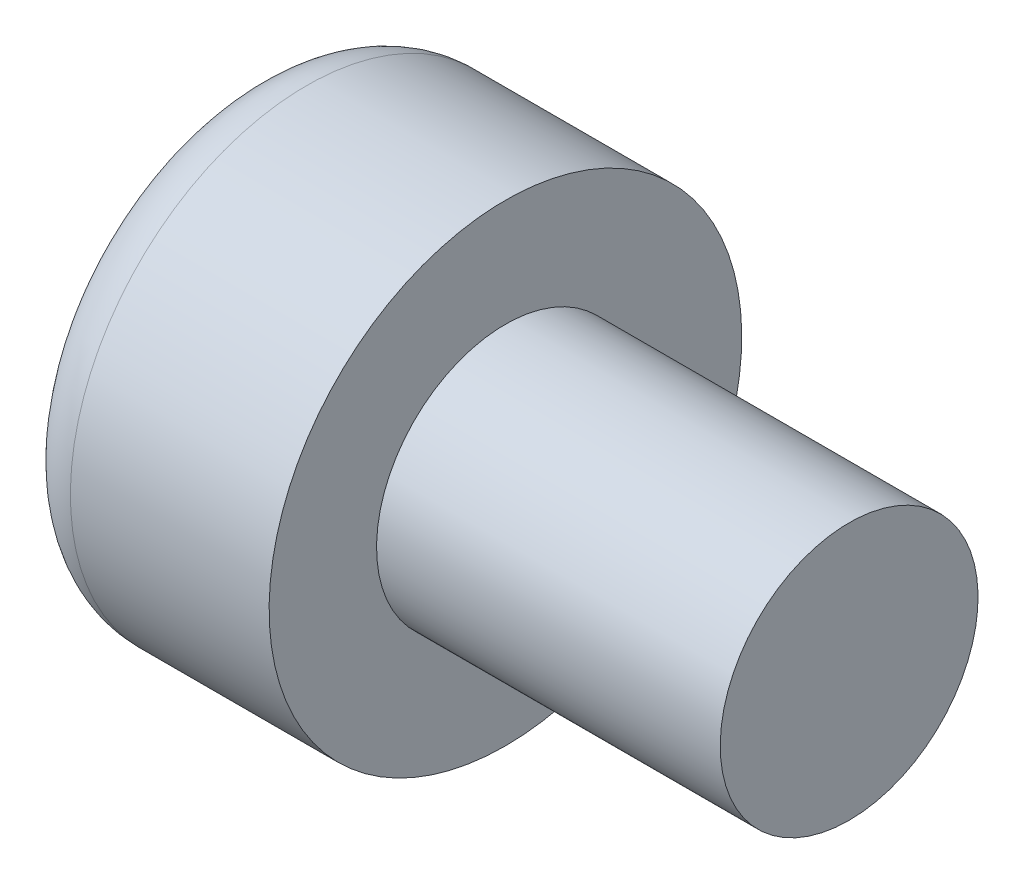
ISO-10303-21;
HEADER;
FILE_DESCRIPTION(('STEP AP214'),'2;1');
FILE_NAME('part.step','',(''),(''),'','','');
FILE_SCHEMA(('AUTOMOTIVE_DESIGN { 1 0 10303 214 1 1 1 1 }'));
ENDSEC;
DATA;
#1=APPLICATION_CONTEXT('core data for automotive mechanical design processes');
#2=APPLICATION_PROTOCOL_DEFINITION('international standard','automotive_design',2000,#1);
#3=PRODUCT_CONTEXT('',#1,'mechanical');
#4=PRODUCT('Part','Part','',(#3));
#5=PRODUCT_RELATED_PRODUCT_CATEGORY('part','',(#4));
#6=PRODUCT_DEFINITION_FORMATION('','',#4);
#7=PRODUCT_DEFINITION_CONTEXT('part definition',#1,'design');
#8=PRODUCT_DEFINITION('design','',#6,#7);
#9=PRODUCT_DEFINITION_SHAPE('','',#8);
#10=(LENGTH_UNIT() NAMED_UNIT(*) SI_UNIT(.MILLI.,.METRE.));
#11=(NAMED_UNIT(*) PLANE_ANGLE_UNIT() SI_UNIT($,.RADIAN.));
#12=(NAMED_UNIT(*) SI_UNIT($,.STERADIAN.) SOLID_ANGLE_UNIT());
#13=UNCERTAINTY_MEASURE_WITH_UNIT(LENGTH_MEASURE(1.E-05),#10,'distance_accuracy_value','');
#14=(GEOMETRIC_REPRESENTATION_CONTEXT(3) GLOBAL_UNCERTAINTY_ASSIGNED_CONTEXT((#13)) GLOBAL_UNIT_ASSIGNED_CONTEXT((#10,
#11,#12)) REPRESENTATION_CONTEXT('',''));
#15=CARTESIAN_POINT('',(0.,0.,0.));
#16=DIRECTION('',(0.,0.,1.));
#17=DIRECTION('',(1.,0.,0.));
#18=AXIS2_PLACEMENT_3D('',#15,#16,#17);
#19=CARTESIAN_POINT('',(0.,0.,0.));
#20=DIRECTION('',(1.,0.,0.));
#21=DIRECTION('',(0.,1.,0.));
#22=AXIS2_PLACEMENT_3D('',#19,#20,#21);
#23=PLANE('',#22);
#24=DIRECTION('',(0.,-0.5,-0.866025403784438));
#25=VECTOR('',#24,1.);
#26=CARTESIAN_POINT('',(0.,1.44337567297406,0.));
#27=LINE('',#26,#25);
#28=CARTESIAN_POINT('',(0.,1.44337567297406,0.));
#29=VERTEX_POINT('',#28);
#30=CARTESIAN_POINT('',(0.,0.721687836487031,-1.25));
#31=VERTEX_POINT('',#30);
#32=EDGE_CURVE('E121',#29,#31,#27,.T.);
#33=ORIENTED_EDGE('',*,*,#32,.F.);
#34=DIRECTION('',(0.,0.5,-0.866025403784439));
#35=VECTOR('',#34,1.);
#36=CARTESIAN_POINT('',(0.,0.721687836487032,1.25));
#37=LINE('',#36,#35);
#38=CARTESIAN_POINT('',(0.,0.721687836487032,1.25));
#39=VERTEX_POINT('',#38);
#40=EDGE_CURVE('E47',#39,#29,#37,.T.);
#41=ORIENTED_EDGE('',*,*,#40,.F.);
#42=DIRECTION('',(0.,1.,0.));
#43=VECTOR('',#42,1.);
#44=CARTESIAN_POINT('',(0.,-0.721687836487031,1.25));
#45=LINE('',#44,#43);
#46=CARTESIAN_POINT('',(0.,-0.721687836487031,1.25));
#47=VERTEX_POINT('',#46);
#48=EDGE_CURVE('E130',#47,#39,#45,.T.);
#49=ORIENTED_EDGE('',*,*,#48,.F.);
#50=DIRECTION('',(0.,0.5,0.866025403784439));
#51=VECTOR('',#50,1.);
#52=CARTESIAN_POINT('',(0.,-1.44337567297406,0.));
#53=LINE('',#52,#51);
#54=CARTESIAN_POINT('',(0.,-1.44337567297406,0.));
#55=VERTEX_POINT('',#54);
#56=EDGE_CURVE('E128',#55,#47,#53,.T.);
#57=ORIENTED_EDGE('',*,*,#56,.F.);
#58=DIRECTION('',(0.,-0.5,0.866025403784438));
#59=VECTOR('',#58,1.);
#60=CARTESIAN_POINT('',(0.,-0.721687836487032,-1.25));
#61=LINE('',#60,#59);
#62=CARTESIAN_POINT('',(0.,-0.721687836487032,-1.25));
#63=VERTEX_POINT('',#62);
#64=EDGE_CURVE('E95',#63,#55,#61,.T.);
#65=ORIENTED_EDGE('',*,*,#64,.F.);
#66=DIRECTION('',(0.,-1.,0.));
#67=VECTOR('',#66,1.);
#68=CARTESIAN_POINT('',(0.,0.721687836487031,-1.25));
#69=LINE('',#68,#67);
#70=EDGE_CURVE('E124',#31,#63,#69,.T.);
#71=ORIENTED_EDGE('',*,*,#70,.F.);
#72=EDGE_LOOP('',(#33,#41,#49,#57,#65,#71));
#73=FACE_BOUND('',#72,.T.);
#74=CARTESIAN_POINT('',(0.,0.,0.));
#75=DIRECTION('',(-1.,0.,0.));
#76=DIRECTION('',(0.,-1.,0.));
#77=AXIS2_PLACEMENT_3D('',#74,#75,#76);
#78=CIRCLE('',#77,2.0625);
#79=CARTESIAN_POINT('',(0.,-2.0625,0.));
#80=VERTEX_POINT('',#79);
#81=EDGE_CURVE('E11',#80,#80,#78,.T.);
#82=ORIENTED_EDGE('',*,*,#81,.T.);
#83=EDGE_LOOP('',(#82));
#84=FACE_BOUND('',#83,.T.);
#85=ADVANCED_FACE('F33',(#73,#84),#23,.F.);
#86=CARTESIAN_POINT('',(0.6875,0.,0.));
#87=DIRECTION('',(-1.,0.,0.));
#88=DIRECTION('',(0.,-1.,0.));
#89=AXIS2_PLACEMENT_3D('',#86,#87,#88);
#90=TOROIDAL_SURFACE('',#89,2.0625,0.6875);
#91=ORIENTED_EDGE('',*,*,#81,.F.);
#92=EDGE_LOOP('',(#91));
#93=FACE_BOUND('',#92,.T.);
#94=CARTESIAN_POINT('',(0.6875,0.,0.));
#95=DIRECTION('',(-1.,0.,0.));
#96=DIRECTION('',(0.,-1.,0.));
#97=AXIS2_PLACEMENT_3D('',#94,#95,#96);
#98=CIRCLE('',#97,2.75);
#99=CARTESIAN_POINT('',(0.6875,-2.75,0.));
#100=VERTEX_POINT('',#99);
#101=EDGE_CURVE('E40',#100,#100,#98,.T.);
#102=ORIENTED_EDGE('',*,*,#101,.T.);
#103=EDGE_LOOP('',(#102));
#104=FACE_BOUND('',#103,.T.);
#105=ADVANCED_FACE('F150',(#93,#104),#90,.T.);
#106=CARTESIAN_POINT('',(0.,0.,0.));
#107=DIRECTION('',(-1.,0.,0.));
#108=DIRECTION('',(0.,-1.,0.));
#109=AXIS2_PLACEMENT_3D('',#106,#107,#108);
#110=CYLINDRICAL_SURFACE('',#109,2.75);
#111=ORIENTED_EDGE('',*,*,#101,.F.);
#112=EDGE_LOOP('',(#111));
#113=FACE_BOUND('',#112,.T.);
#114=CARTESIAN_POINT('',(3.,0.,0.));
#115=DIRECTION('',(-1.,0.,0.));
#116=DIRECTION('',(0.,-1.,0.));
#117=AXIS2_PLACEMENT_3D('',#114,#115,#116);
#118=CIRCLE('',#117,2.75);
#119=CARTESIAN_POINT('',(3.,-2.75,0.));
#120=VERTEX_POINT('',#119);
#121=EDGE_CURVE('E145',#120,#120,#118,.T.);
#122=ORIENTED_EDGE('',*,*,#121,.T.);
#123=EDGE_LOOP('',(#122));
#124=FACE_BOUND('',#123,.T.);
#125=ADVANCED_FACE('F152',(#113,#124),#110,.T.);
#126=CARTESIAN_POINT('',(3.,2.75,0.));
#127=DIRECTION('',(-1.,0.,0.));
#128=DIRECTION('',(0.,-1.,0.));
#129=AXIS2_PLACEMENT_3D('',#126,#127,#128);
#130=PLANE('',#129);
#131=ORIENTED_EDGE('',*,*,#121,.F.);
#132=EDGE_LOOP('',(#131));
#133=FACE_BOUND('',#132,.T.);
#134=CARTESIAN_POINT('',(3.,0.,0.));
#135=DIRECTION('',(-1.,0.,0.));
#136=DIRECTION('',(0.,-1.,0.));
#137=AXIS2_PLACEMENT_3D('',#134,#135,#136);
#138=CIRCLE('',#137,1.5);
#139=CARTESIAN_POINT('',(3.,-1.5,0.));
#140=VERTEX_POINT('',#139);
#141=EDGE_CURVE('E142',#140,#140,#138,.T.);
#142=ORIENTED_EDGE('',*,*,#141,.T.);
#143=EDGE_LOOP('',(#142));
#144=FACE_BOUND('',#143,.T.);
#145=ADVANCED_FACE('F155',(#133,#144),#130,.F.);
#146=CARTESIAN_POINT('',(0.,0.,0.));
#147=DIRECTION('',(-1.,0.,0.));
#148=DIRECTION('',(0.,-1.,0.));
#149=AXIS2_PLACEMENT_3D('',#146,#147,#148);
#150=CYLINDRICAL_SURFACE('',#149,1.5);
#151=ORIENTED_EDGE('',*,*,#141,.F.);
#152=EDGE_LOOP('',(#151));
#153=FACE_BOUND('',#152,.T.);
#154=CARTESIAN_POINT('',(7.,0.,0.));
#155=DIRECTION('',(-1.,0.,0.));
#156=DIRECTION('',(0.,-1.,0.));
#157=AXIS2_PLACEMENT_3D('',#154,#155,#156);
#158=CIRCLE('',#157,1.5);
#159=CARTESIAN_POINT('',(7.,-1.5,0.));
#160=VERTEX_POINT('',#159);
#161=EDGE_CURVE('E134',#160,#160,#158,.T.);
#162=ORIENTED_EDGE('',*,*,#161,.T.);
#163=EDGE_LOOP('',(#162));
#164=FACE_BOUND('',#163,.T.);
#165=ADVANCED_FACE('F161',(#153,#164),#150,.T.);
#166=CARTESIAN_POINT('',(7.,1.5,0.));
#167=DIRECTION('',(-1.,0.,0.));
#168=DIRECTION('',(0.,-1.,0.));
#169=AXIS2_PLACEMENT_3D('',#166,#167,#168);
#170=PLANE('',#169);
#171=ORIENTED_EDGE('',*,*,#161,.F.);
#172=EDGE_LOOP('',(#171));
#173=FACE_BOUND('',#172,.T.);
#174=ADVANCED_FACE('F167',(#173),#170,.F.);
#175=CARTESIAN_POINT('',(1.5,0.721687836487032,1.25));
#176=DIRECTION('',(0.,0.866025403784438,0.5));
#177=DIRECTION('',(0.,-0.5,0.866025403784439));
#178=AXIS2_PLACEMENT_3D('',#175,#176,#177);
#179=PLANE('',#178);
#180=ORIENTED_EDGE('',*,*,#40,.T.);
#181=DIRECTION('',(-1.,0.,0.));
#182=VECTOR('',#181,1.);
#183=CARTESIAN_POINT('',(1.5,1.44337567297406,0.));
#184=LINE('',#183,#182);
#185=CARTESIAN_POINT('',(1.5,1.44337567297406,0.));
#186=VERTEX_POINT('',#185);
#187=EDGE_CURVE('E77',#186,#29,#184,.T.);
#188=ORIENTED_EDGE('',*,*,#187,.F.);
#189=DIRECTION('',(0.,0.5,-0.866025403784439));
#190=VECTOR('',#189,1.);
#191=CARTESIAN_POINT('',(1.5,0.721687836487032,1.25));
#192=LINE('',#191,#190);
#193=CARTESIAN_POINT('',(1.5,0.721687836487032,1.25));
#194=VERTEX_POINT('',#193);
#195=EDGE_CURVE('E132',#194,#186,#192,.T.);
#196=ORIENTED_EDGE('',*,*,#195,.F.);
#197=DIRECTION('',(-1.,0.,0.));
#198=VECTOR('',#197,1.);
#199=CARTESIAN_POINT('',(1.5,0.721687836487032,1.25));
#200=LINE('',#199,#198);
#201=EDGE_CURVE('E55',#194,#39,#200,.T.);
#202=ORIENTED_EDGE('',*,*,#201,.T.);
#203=EDGE_LOOP('',(#180,#188,#196,#202));
#204=FACE_BOUND('',#203,.T.);
#205=ADVANCED_FACE('F172',(#204),#179,.F.);
#206=CARTESIAN_POINT('',(1.5,-0.721687836487031,1.25));
#207=DIRECTION('',(0.,0.,1.));
#208=DIRECTION('',(1.,0.,0.));
#209=AXIS2_PLACEMENT_3D('',#206,#207,#208);
#210=PLANE('',#209);
#211=ORIENTED_EDGE('',*,*,#48,.T.);
#212=ORIENTED_EDGE('',*,*,#201,.F.);
#213=DIRECTION('',(0.,1.,0.));
#214=VECTOR('',#213,1.);
#215=CARTESIAN_POINT('',(1.5,-0.721687836487031,1.25));
#216=LINE('',#215,#214);
#217=CARTESIAN_POINT('',(1.5,-0.721687836487031,1.25));
#218=VERTEX_POINT('',#217);
#219=EDGE_CURVE('E107',#218,#194,#216,.T.);
#220=ORIENTED_EDGE('',*,*,#219,.F.);
#221=DIRECTION('',(-1.,0.,0.));
#222=VECTOR('',#221,1.);
#223=CARTESIAN_POINT('',(1.5,-0.721687836487031,1.25));
#224=LINE('',#223,#222);
#225=EDGE_CURVE('E99',#218,#47,#224,.T.);
#226=ORIENTED_EDGE('',*,*,#225,.T.);
#227=EDGE_LOOP('',(#211,#212,#220,#226));
#228=FACE_BOUND('',#227,.T.);
#229=ADVANCED_FACE('F177',(#228),#210,.F.);
#230=CARTESIAN_POINT('',(1.5,-1.44337567297406,0.));
#231=DIRECTION('',(0.,-0.866025403784439,0.5));
#232=DIRECTION('',(0.,-0.5,-0.866025403784439));
#233=AXIS2_PLACEMENT_3D('',#230,#231,#232);
#234=PLANE('',#233);
#235=ORIENTED_EDGE('',*,*,#56,.T.);
#236=ORIENTED_EDGE('',*,*,#225,.F.);
#237=DIRECTION('',(0.,0.5,0.866025403784439));
#238=VECTOR('',#237,1.);
#239=CARTESIAN_POINT('',(1.5,-1.44337567297406,0.));
#240=LINE('',#239,#238);
#241=CARTESIAN_POINT('',(1.5,-1.44337567297406,0.));
#242=VERTEX_POINT('',#241);
#243=EDGE_CURVE('E103',#242,#218,#240,.T.);
#244=ORIENTED_EDGE('',*,*,#243,.F.);
#245=DIRECTION('',(-1.,0.,0.));
#246=VECTOR('',#245,1.);
#247=CARTESIAN_POINT('',(1.5,-1.44337567297406,0.));
#248=LINE('',#247,#246);
#249=EDGE_CURVE('E88',#242,#55,#248,.T.);
#250=ORIENTED_EDGE('',*,*,#249,.T.);
#251=EDGE_LOOP('',(#235,#236,#244,#250));
#252=FACE_BOUND('',#251,.T.);
#253=ADVANCED_FACE('F104',(#252),#234,.F.);
#254=CARTESIAN_POINT('',(1.5,-0.721687836487032,-1.25));
#255=DIRECTION('',(0.,-0.866025403784438,-0.5));
#256=DIRECTION('',(0.,0.5,-0.866025403784438));
#257=AXIS2_PLACEMENT_3D('',#254,#255,#256);
#258=PLANE('',#257);
#259=ORIENTED_EDGE('',*,*,#64,.T.);
#260=ORIENTED_EDGE('',*,*,#249,.F.);
#261=DIRECTION('',(0.,-0.5,0.866025403784438));
#262=VECTOR('',#261,1.);
#263=CARTESIAN_POINT('',(1.5,-0.721687836487032,-1.25));
#264=LINE('',#263,#262);
#265=CARTESIAN_POINT('',(1.5,-0.721687836487032,-1.25));
#266=VERTEX_POINT('',#265);
#267=EDGE_CURVE('E92',#266,#242,#264,.T.);
#268=ORIENTED_EDGE('',*,*,#267,.F.);
#269=DIRECTION('',(-1.,0.,0.));
#270=VECTOR('',#269,1.);
#271=CARTESIAN_POINT('',(1.5,-0.721687836487032,-1.25));
#272=LINE('',#271,#270);
#273=EDGE_CURVE('E100',#266,#63,#272,.T.);
#274=ORIENTED_EDGE('',*,*,#273,.T.);
#275=EDGE_LOOP('',(#259,#260,#268,#274));
#276=FACE_BOUND('',#275,.T.);
#277=ADVANCED_FACE('F90',(#276),#258,.F.);
#278=CARTESIAN_POINT('',(1.5,0.721687836487031,-1.25));
#279=DIRECTION('',(0.,0.,-1.));
#280=DIRECTION('',(-1.,0.,0.));
#281=AXIS2_PLACEMENT_3D('',#278,#279,#280);
#282=PLANE('',#281);
#283=ORIENTED_EDGE('',*,*,#70,.T.);
#284=ORIENTED_EDGE('',*,*,#273,.F.);
#285=DIRECTION('',(0.,-1.,0.));
#286=VECTOR('',#285,1.);
#287=CARTESIAN_POINT('',(1.5,0.721687836487031,-1.25));
#288=LINE('',#287,#286);
#289=CARTESIAN_POINT('',(1.5,0.721687836487031,-1.25));
#290=VERTEX_POINT('',#289);
#291=EDGE_CURVE('E113',#290,#266,#288,.T.);
#292=ORIENTED_EDGE('',*,*,#291,.F.);
#293=DIRECTION('',(-1.,0.,0.));
#294=VECTOR('',#293,1.);
#295=CARTESIAN_POINT('',(1.5,0.721687836487031,-1.25));
#296=LINE('',#295,#294);
#297=EDGE_CURVE('E137',#290,#31,#296,.T.);
#298=ORIENTED_EDGE('',*,*,#297,.T.);
#299=EDGE_LOOP('',(#283,#284,#292,#298));
#300=FACE_BOUND('',#299,.T.);
#301=ADVANCED_FACE('F203',(#300),#282,.F.);
#302=CARTESIAN_POINT('',(1.5,1.44337567297406,0.));
#303=DIRECTION('',(0.,0.866025403784438,-0.5));
#304=DIRECTION('',(0.,0.5,0.866025403784439));
#305=AXIS2_PLACEMENT_3D('',#302,#303,#304);
#306=PLANE('',#305);
#307=ORIENTED_EDGE('',*,*,#32,.T.);
#308=ORIENTED_EDGE('',*,*,#297,.F.);
#309=DIRECTION('',(0.,-0.5,-0.866025403784438));
#310=VECTOR('',#309,1.);
#311=CARTESIAN_POINT('',(1.5,1.44337567297406,0.));
#312=LINE('',#311,#310);
#313=EDGE_CURVE('E115',#186,#290,#312,.T.);
#314=ORIENTED_EDGE('',*,*,#313,.F.);
#315=ORIENTED_EDGE('',*,*,#187,.T.);
#316=EDGE_LOOP('',(#307,#308,#314,#315));
#317=FACE_BOUND('',#316,.T.);
#318=ADVANCED_FACE('F191',(#317),#306,.F.);
#319=CARTESIAN_POINT('',(1.5,0.,0.));
#320=DIRECTION('',(-1.,0.,0.));
#321=DIRECTION('',(0.,-1.,0.));
#322=AXIS2_PLACEMENT_3D('',#319,#320,#321);
#323=PLANE('',#322);
#324=ORIENTED_EDGE('',*,*,#195,.T.);
#325=ORIENTED_EDGE('',*,*,#313,.T.);
#326=ORIENTED_EDGE('',*,*,#291,.T.);
#327=ORIENTED_EDGE('',*,*,#267,.T.);
#328=ORIENTED_EDGE('',*,*,#243,.T.);
#329=ORIENTED_EDGE('',*,*,#219,.T.);
#330=EDGE_LOOP('',(#324,#325,#326,#327,#328,#329));
#331=FACE_BOUND('',#330,.T.);
#332=ADVANCED_FACE('F110',(#331),#323,.T.);
#333=CLOSED_SHELL('',(#85,#105,#125,#145,#165,#174,#205,#229,#253,#277,#301,#318,#332));
#334=MANIFOLD_SOLID_BREP('B2',#333);
#335=ADVANCED_BREP_SHAPE_REPRESENTATION('',(#18,#334),#14);
#336=SHAPE_DEFINITION_REPRESENTATION(#9,#335);
ENDSEC;
END-ISO-10303-21;
